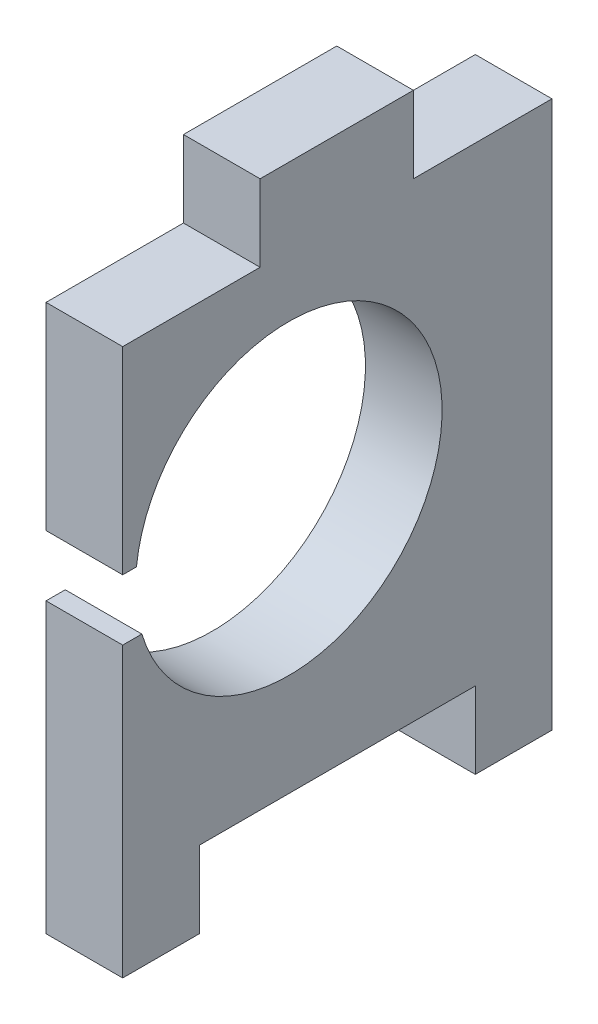
ISO-10303-21;
HEADER;
FILE_DESCRIPTION(('STEP AP214'),'2;1');
FILE_NAME('part.step','',(''),(''),'','','');
FILE_SCHEMA(('AUTOMOTIVE_DESIGN { 1 0 10303 214 1 1 1 1 }'));
ENDSEC;
DATA;
#1=APPLICATION_CONTEXT('core data for automotive mechanical design processes');
#2=APPLICATION_PROTOCOL_DEFINITION('international standard','automotive_design',2000,#1);
#3=PRODUCT_CONTEXT('',#1,'mechanical');
#4=PRODUCT('Part','Part','',(#3));
#5=PRODUCT_RELATED_PRODUCT_CATEGORY('part','',(#4));
#6=PRODUCT_DEFINITION_FORMATION('','',#4);
#7=PRODUCT_DEFINITION_CONTEXT('part definition',#1,'design');
#8=PRODUCT_DEFINITION('design','',#6,#7);
#9=PRODUCT_DEFINITION_SHAPE('','',#8);
#10=(LENGTH_UNIT() NAMED_UNIT(*) SI_UNIT(.MILLI.,.METRE.));
#11=(NAMED_UNIT(*) PLANE_ANGLE_UNIT() SI_UNIT($,.RADIAN.));
#12=(NAMED_UNIT(*) SI_UNIT($,.STERADIAN.) SOLID_ANGLE_UNIT());
#13=UNCERTAINTY_MEASURE_WITH_UNIT(LENGTH_MEASURE(1.E-05),#10,'distance_accuracy_value','');
#14=(GEOMETRIC_REPRESENTATION_CONTEXT(3) GLOBAL_UNCERTAINTY_ASSIGNED_CONTEXT((#13)) GLOBAL_UNIT_ASSIGNED_CONTEXT((#10,
#11,#12)) REPRESENTATION_CONTEXT('',''));
#15=CARTESIAN_POINT('',(0.,0.,0.));
#16=DIRECTION('',(0.,0.,1.));
#17=DIRECTION('',(1.,0.,0.));
#18=AXIS2_PLACEMENT_3D('',#15,#16,#17);
#19=CARTESIAN_POINT('',(80.894661100132,18.4,0.));
#20=DIRECTION('',(0.,1.,0.));
#21=DIRECTION('',(0.,0.,1.));
#22=AXIS2_PLACEMENT_3D('',#19,#20,#21);
#23=PLANE('',#22);
#24=DIRECTION('',(0.,0.,1.));
#25=VECTOR('',#24,1.);
#26=CARTESIAN_POINT('',(80.894661100132,18.4,0.));
#27=LINE('',#26,#25);
#28=CARTESIAN_POINT('',(80.894661100132,18.4,-16.8));
#29=VERTEX_POINT('',#28);
#30=CARTESIAN_POINT('',(80.894661100132,18.4,-11.3779778877362));
#31=VERTEX_POINT('',#30);
#32=EDGE_CURVE('E200',#29,#31,#27,.T.);
#33=ORIENTED_EDGE('',*,*,#32,.T.);
#34=DIRECTION('',(1.,0.,0.));
#35=VECTOR('',#34,1.);
#36=CARTESIAN_POINT('',(74.1864571676327,18.4,-11.3779778877362));
#37=LINE('',#36,#35);
#38=CARTESIAN_POINT('',(83.894661100132,18.4,-11.3779778877362));
#39=VERTEX_POINT('',#38);
#40=EDGE_CURVE('E259',#31,#39,#37,.T.);
#41=ORIENTED_EDGE('',*,*,#40,.T.);
#42=DIRECTION('',(0.,0.,1.));
#43=VECTOR('',#42,1.);
#44=CARTESIAN_POINT('',(83.894661100132,18.4,0.));
#45=LINE('',#44,#43);
#46=CARTESIAN_POINT('',(83.894661100132,18.4,-16.8));
#47=VERTEX_POINT('',#46);
#48=EDGE_CURVE('E206',#47,#39,#45,.T.);
#49=ORIENTED_EDGE('',*,*,#48,.F.);
#50=DIRECTION('',(1.,0.,0.));
#51=VECTOR('',#50,1.);
#52=CARTESIAN_POINT('',(80.894661100132,18.4,-16.8));
#53=LINE('',#52,#51);
#54=EDGE_CURVE('E213',#29,#47,#53,.T.);
#55=ORIENTED_EDGE('',*,*,#54,.F.);
#56=EDGE_LOOP('',(#33,#41,#49,#55));
#57=FACE_BOUND('',#56,.T.);
#58=ADVANCED_FACE('F32',(#57),#23,.T.);
#59=CARTESIAN_POINT('',(80.894661100132,18.4,0.));
#60=DIRECTION('',(0.,0.,1.));
#61=DIRECTION('',(1.,0.,0.));
#62=AXIS2_PLACEMENT_3D('',#59,#60,#61);
#63=PLANE('',#62);
#64=DIRECTION('',(0.,-1.,0.));
#65=VECTOR('',#64,1.);
#66=CARTESIAN_POINT('',(83.894661100132,18.4,0.));
#67=LINE('',#66,#65);
#68=CARTESIAN_POINT('',(83.894661100132,18.4,0.));
#69=VERTEX_POINT('',#68);
#70=CARTESIAN_POINT('',(83.894661100132,10.6647891217904,0.));
#71=VERTEX_POINT('',#70);
#72=EDGE_CURVE('E161',#69,#71,#67,.T.);
#73=ORIENTED_EDGE('',*,*,#72,.F.);
#74=DIRECTION('',(1.,0.,0.));
#75=VECTOR('',#74,1.);
#76=CARTESIAN_POINT('',(80.894661100132,18.4,0.));
#77=LINE('',#76,#75);
#78=CARTESIAN_POINT('',(80.894661100132,18.4,0.));
#79=VERTEX_POINT('',#78);
#80=EDGE_CURVE('E40',#79,#69,#77,.T.);
#81=ORIENTED_EDGE('',*,*,#80,.F.);
#82=DIRECTION('',(0.,-1.,0.));
#83=VECTOR('',#82,1.);
#84=CARTESIAN_POINT('',(80.894661100132,18.4,0.));
#85=LINE('',#84,#83);
#86=CARTESIAN_POINT('',(80.894661100132,10.6647891217904,0.));
#87=VERTEX_POINT('',#86);
#88=EDGE_CURVE('E221',#79,#87,#85,.T.);
#89=ORIENTED_EDGE('',*,*,#88,.T.);
#90=DIRECTION('',(1.,0.,0.));
#91=VECTOR('',#90,1.);
#92=CARTESIAN_POINT('',(80.894661100132,10.6647891217904,0.));
#93=LINE('',#92,#91);
#94=EDGE_CURVE('E203',#87,#71,#93,.T.);
#95=ORIENTED_EDGE('',*,*,#94,.T.);
#96=EDGE_LOOP('',(#73,#81,#89,#95));
#97=FACE_BOUND('',#96,.T.);
#98=ADVANCED_FACE('F34',(#97),#63,.T.);
#99=DIRECTION('',(1.,0.,0.));
#100=VECTOR('',#99,1.);
#101=CARTESIAN_POINT('',(74.1864571676327,18.4,-5.37797788773624));
#102=LINE('',#101,#100);
#103=CARTESIAN_POINT('',(80.894661100132,18.4,-5.37797788773624));
#104=VERTEX_POINT('',#103);
#105=CARTESIAN_POINT('',(83.894661100132,18.4,-5.37797788773624));
#106=VERTEX_POINT('',#105);
#107=EDGE_CURVE('E166',#104,#106,#102,.T.);
#108=ORIENTED_EDGE('',*,*,#107,.F.);
#109=EDGE_CURVE('E194',#104,#79,#27,.T.);
#110=ORIENTED_EDGE('',*,*,#109,.T.);
#111=ORIENTED_EDGE('',*,*,#80,.T.);
#112=EDGE_CURVE('E204',#106,#69,#45,.T.);
#113=ORIENTED_EDGE('',*,*,#112,.F.);
#114=EDGE_LOOP('',(#108,#110,#111,#113));
#115=FACE_BOUND('',#114,.T.);
#116=ADVANCED_FACE('F281',(#115),#23,.T.);
#117=CARTESIAN_POINT('',(80.894661100132,18.4,-16.8));
#118=DIRECTION('',(0.,0.,-1.));
#119=DIRECTION('',(-1.,0.,0.));
#120=AXIS2_PLACEMENT_3D('',#117,#118,#119);
#121=PLANE('',#120);
#122=DIRECTION('',(0.,1.,0.));
#123=VECTOR('',#122,1.);
#124=CARTESIAN_POINT('',(83.894661100132,18.4,-16.8));
#125=LINE('',#124,#123);
#126=CARTESIAN_POINT('',(83.894661100132,-3.,-16.8));
#127=VERTEX_POINT('',#126);
#128=EDGE_CURVE('E174',#127,#47,#125,.T.);
#129=ORIENTED_EDGE('',*,*,#128,.F.);
#130=DIRECTION('',(1.,0.,0.));
#131=VECTOR('',#130,1.);
#132=CARTESIAN_POINT('',(74.1864571676327,-3.,-16.8));
#133=LINE('',#132,#131);
#134=CARTESIAN_POINT('',(80.894661100132,-3.,-16.8));
#135=VERTEX_POINT('',#134);
#136=EDGE_CURVE('E483',#135,#127,#133,.T.);
#137=ORIENTED_EDGE('',*,*,#136,.F.);
#138=DIRECTION('',(0.,1.,0.));
#139=VECTOR('',#138,1.);
#140=CARTESIAN_POINT('',(80.894661100132,18.4,-16.8));
#141=LINE('',#140,#139);
#142=EDGE_CURVE('E185',#135,#29,#141,.T.);
#143=ORIENTED_EDGE('',*,*,#142,.T.);
#144=ORIENTED_EDGE('',*,*,#54,.T.);
#145=EDGE_LOOP('',(#129,#137,#143,#144));
#146=FACE_BOUND('',#145,.T.);
#147=ADVANCED_FACE('F283',(#146),#121,.T.);
#148=CARTESIAN_POINT('',(80.894661100132,0.,0.));
#149=DIRECTION('',(0.,-1.,0.));
#150=DIRECTION('',(0.,0.,-1.));
#151=AXIS2_PLACEMENT_3D('',#148,#149,#150);
#152=PLANE('',#151);
#153=DIRECTION('',(1.,0.,0.));
#154=VECTOR('',#153,1.);
#155=CARTESIAN_POINT('',(74.1864571676327,0.,-13.8));
#156=LINE('',#155,#154);
#157=CARTESIAN_POINT('',(80.894661100132,0.,-13.8));
#158=VERTEX_POINT('',#157);
#159=CARTESIAN_POINT('',(83.894661100132,0.,-13.8));
#160=VERTEX_POINT('',#159);
#161=EDGE_CURVE('E465',#158,#160,#156,.T.);
#162=ORIENTED_EDGE('',*,*,#161,.T.);
#163=DIRECTION('',(0.,0.,-1.));
#164=VECTOR('',#163,1.);
#165=CARTESIAN_POINT('',(83.894661100132,0.,0.));
#166=LINE('',#165,#164);
#167=CARTESIAN_POINT('',(83.894661100132,0.,-3.));
#168=VERTEX_POINT('',#167);
#169=EDGE_CURVE('E171',#168,#160,#166,.T.);
#170=ORIENTED_EDGE('',*,*,#169,.F.);
#171=DIRECTION('',(1.,0.,0.));
#172=VECTOR('',#171,1.);
#173=CARTESIAN_POINT('',(74.1864571676327,0.,-3.));
#174=LINE('',#173,#172);
#175=CARTESIAN_POINT('',(80.894661100132,0.,-3.));
#176=VERTEX_POINT('',#175);
#177=EDGE_CURVE('E54',#176,#168,#174,.T.);
#178=ORIENTED_EDGE('',*,*,#177,.F.);
#179=DIRECTION('',(0.,0.,-1.));
#180=VECTOR('',#179,1.);
#181=CARTESIAN_POINT('',(80.894661100132,0.,0.));
#182=LINE('',#181,#180);
#183=EDGE_CURVE('E182',#176,#158,#182,.T.);
#184=ORIENTED_EDGE('',*,*,#183,.T.);
#185=EDGE_LOOP('',(#162,#170,#178,#184));
#186=FACE_BOUND('',#185,.T.);
#187=ADVANCED_FACE('F289',(#186),#152,.T.);
#188=CARTESIAN_POINT('',(80.894661100132,8.28400240204985,0.));
#189=DIRECTION('',(0.,0.,1.));
#190=DIRECTION('',(1.,0.,0.));
#191=AXIS2_PLACEMENT_3D('',#188,#189,#190);
#192=PLANE('',#191);
#193=DIRECTION('',(0.,-1.,0.));
#194=VECTOR('',#193,1.);
#195=CARTESIAN_POINT('',(83.894661100132,8.28400240204985,0.));
#196=LINE('',#195,#194);
#197=CARTESIAN_POINT('',(83.894661100132,8.28400240204985,0.));
#198=VERTEX_POINT('',#197);
#199=CARTESIAN_POINT('',(83.894661100132,-3.,0.));
#200=VERTEX_POINT('',#199);
#201=EDGE_CURVE('E164',#198,#200,#196,.T.);
#202=ORIENTED_EDGE('',*,*,#201,.F.);
#203=DIRECTION('',(1.,0.,0.));
#204=VECTOR('',#203,1.);
#205=CARTESIAN_POINT('',(80.894661100132,8.28400240204985,0.));
#206=LINE('',#205,#204);
#207=CARTESIAN_POINT('',(80.894661100132,8.28400240204985,0.));
#208=VERTEX_POINT('',#207);
#209=EDGE_CURVE('E215',#208,#198,#206,.T.);
#210=ORIENTED_EDGE('',*,*,#209,.F.);
#211=DIRECTION('',(0.,-1.,0.));
#212=VECTOR('',#211,1.);
#213=CARTESIAN_POINT('',(80.894661100132,8.28400240204985,0.));
#214=LINE('',#213,#212);
#215=CARTESIAN_POINT('',(80.894661100132,-3.,0.));
#216=VERTEX_POINT('',#215);
#217=EDGE_CURVE('E186',#208,#216,#214,.T.);
#218=ORIENTED_EDGE('',*,*,#217,.T.);
#219=DIRECTION('',(1.,0.,0.));
#220=VECTOR('',#219,1.);
#221=CARTESIAN_POINT('',(74.1864571676327,-3.,0.));
#222=LINE('',#221,#220);
#223=EDGE_CURVE('E242',#216,#200,#222,.T.);
#224=ORIENTED_EDGE('',*,*,#223,.T.);
#225=EDGE_LOOP('',(#202,#210,#218,#224));
#226=FACE_BOUND('',#225,.T.);
#227=ADVANCED_FACE('F420',(#226),#192,.T.);
#228=CARTESIAN_POINT('',(80.894661100132,8.28400240204985,0.));
#229=DIRECTION('',(0.,1.,0.));
#230=DIRECTION('',(0.,0.,1.));
#231=AXIS2_PLACEMENT_3D('',#228,#229,#230);
#232=PLANE('',#231);
#233=DIRECTION('',(1.,0.,0.));
#234=VECTOR('',#233,1.);
#235=CARTESIAN_POINT('',(-4.09999999999999,8.28400240204985,-0.750621577611251));
#236=LINE('',#235,#234);
#237=CARTESIAN_POINT('',(80.894661100132,8.28400240204985,-0.750621577611251));
#238=VERTEX_POINT('',#237);
#239=CARTESIAN_POINT('',(83.894661100132,8.28400240204985,-0.750621577611251));
#240=VERTEX_POINT('',#239);
#241=EDGE_CURVE('E47',#238,#240,#236,.T.);
#242=ORIENTED_EDGE('',*,*,#241,.F.);
#243=DIRECTION('',(0.,0.,1.));
#244=VECTOR('',#243,1.);
#245=CARTESIAN_POINT('',(80.894661100132,8.28400240204985,0.));
#246=LINE('',#245,#244);
#247=EDGE_CURVE('E226',#238,#208,#246,.T.);
#248=ORIENTED_EDGE('',*,*,#247,.T.);
#249=ORIENTED_EDGE('',*,*,#209,.T.);
#250=DIRECTION('',(0.,0.,1.));
#251=VECTOR('',#250,1.);
#252=CARTESIAN_POINT('',(83.894661100132,8.28400240204985,0.));
#253=LINE('',#252,#251);
#254=EDGE_CURVE('E162',#240,#198,#253,.T.);
#255=ORIENTED_EDGE('',*,*,#254,.F.);
#256=EDGE_LOOP('',(#242,#248,#249,#255));
#257=FACE_BOUND('',#256,.T.);
#258=ADVANCED_FACE('F411',(#257),#232,.T.);
#259=CARTESIAN_POINT('',(80.894661100132,10.6647891217904,-3.46505971101863));
#260=DIRECTION('',(0.,-1.,0.));
#261=DIRECTION('',(0.,0.,-1.));
#262=AXIS2_PLACEMENT_3D('',#259,#260,#261);
#263=PLANE('',#262);
#264=DIRECTION('',(1.,0.,0.));
#265=VECTOR('',#264,1.);
#266=CARTESIAN_POINT('',(-4.09999999999999,10.6647891217904,-0.536942443381146));
#267=LINE('',#266,#265);
#268=CARTESIAN_POINT('',(83.894661100132,10.6647891217904,-0.536942443381145));
#269=VERTEX_POINT('',#268);
#270=CARTESIAN_POINT('',(80.894661100132,10.6647891217904,-0.536942443381146));
#271=VERTEX_POINT('',#270);
#272=EDGE_CURVE('E144',#269,#271,#267,.F.);
#273=ORIENTED_EDGE('',*,*,#272,.F.);
#274=DIRECTION('',(0.,0.,-1.));
#275=VECTOR('',#274,1.);
#276=CARTESIAN_POINT('',(83.894661100132,10.6647891217904,-3.46505971101863));
#277=LINE('',#276,#275);
#278=EDGE_CURVE('E153',#71,#269,#277,.T.);
#279=ORIENTED_EDGE('',*,*,#278,.F.);
#280=ORIENTED_EDGE('',*,*,#94,.F.);
#281=DIRECTION('',(0.,0.,-1.));
#282=VECTOR('',#281,1.);
#283=CARTESIAN_POINT('',(80.894661100132,10.6647891217904,-3.46505971101863));
#284=LINE('',#283,#282);
#285=EDGE_CURVE('E156',#87,#271,#284,.T.);
#286=ORIENTED_EDGE('',*,*,#285,.T.);
#287=EDGE_LOOP('',(#273,#279,#280,#286));
#288=FACE_BOUND('',#287,.T.);
#289=ADVANCED_FACE('F152',(#288),#263,.T.);
#290=CARTESIAN_POINT('',(80.894661100132,0.,0.));
#291=DIRECTION('',(-1.,0.,0.));
#292=DIRECTION('',(0.,0.,1.));
#293=AXIS2_PLACEMENT_3D('',#290,#291,#292);
#294=PLANE('',#293);
#295=CARTESIAN_POINT('',(80.894661100132,10.,-6.5));
#296=DIRECTION('',(-1.,0.,0.));
#297=DIRECTION('',(0.,0.,1.));
#298=AXIS2_PLACEMENT_3D('',#295,#296,#297);
#299=CIRCLE('',#298,6.);
#300=EDGE_CURVE('E157',#271,#238,#299,.T.);
#301=ORIENTED_EDGE('',*,*,#300,.F.);
#302=ORIENTED_EDGE('',*,*,#285,.F.);
#303=ORIENTED_EDGE('',*,*,#88,.F.);
#304=ORIENTED_EDGE('',*,*,#109,.F.);
#305=DIRECTION('',(0.,-1.,0.));
#306=VECTOR('',#305,1.);
#307=CARTESIAN_POINT('',(80.894661100132,18.4,-5.37797788773624));
#308=LINE('',#307,#306);
#309=CARTESIAN_POINT('',(80.894661100132,21.4,-5.37797788773624));
#310=VERTEX_POINT('',#309);
#311=EDGE_CURVE('E236',#310,#104,#308,.T.);
#312=ORIENTED_EDGE('',*,*,#311,.F.);
#313=DIRECTION('',(0.,0.,1.));
#314=VECTOR('',#313,1.);
#315=CARTESIAN_POINT('',(80.894661100132,21.4,-5.37797788773624));
#316=LINE('',#315,#314);
#317=CARTESIAN_POINT('',(80.894661100132,21.4,-11.3779778877362));
#318=VERTEX_POINT('',#317);
#319=EDGE_CURVE('E260',#318,#310,#316,.T.);
#320=ORIENTED_EDGE('',*,*,#319,.F.);
#321=DIRECTION('',(0.,1.,0.));
#322=VECTOR('',#321,1.);
#323=CARTESIAN_POINT('',(80.894661100132,18.4,-11.3779778877362));
#324=LINE('',#323,#322);
#325=EDGE_CURVE('E265',#31,#318,#324,.T.);
#326=ORIENTED_EDGE('',*,*,#325,.F.);
#327=ORIENTED_EDGE('',*,*,#32,.F.);
#328=ORIENTED_EDGE('',*,*,#142,.F.);
#329=DIRECTION('',(0.,0.,-1.));
#330=VECTOR('',#329,1.);
#331=CARTESIAN_POINT('',(80.894661100132,-3.,-16.8));
#332=LINE('',#331,#330);
#333=CARTESIAN_POINT('',(80.894661100132,-3.,-13.8));
#334=VERTEX_POINT('',#333);
#335=EDGE_CURVE('E493',#334,#135,#332,.T.);
#336=ORIENTED_EDGE('',*,*,#335,.F.);
#337=DIRECTION('',(0.,-1.,0.));
#338=VECTOR('',#337,1.);
#339=CARTESIAN_POINT('',(80.894661100132,0.,-13.8));
#340=LINE('',#339,#338);
#341=EDGE_CURVE('E467',#158,#334,#340,.T.);
#342=ORIENTED_EDGE('',*,*,#341,.F.);
#343=ORIENTED_EDGE('',*,*,#183,.F.);
#344=DIRECTION('',(0.,1.,0.));
#345=VECTOR('',#344,1.);
#346=CARTESIAN_POINT('',(80.894661100132,0.,-3.));
#347=LINE('',#346,#345);
#348=CARTESIAN_POINT('',(80.894661100132,-3.,-3.));
#349=VERTEX_POINT('',#348);
#350=EDGE_CURVE('E254',#349,#176,#347,.T.);
#351=ORIENTED_EDGE('',*,*,#350,.F.);
#352=DIRECTION('',(0.,0.,-1.));
#353=VECTOR('',#352,1.);
#354=CARTESIAN_POINT('',(80.894661100132,-3.,0.));
#355=LINE('',#354,#353);
#356=EDGE_CURVE('E480',#216,#349,#355,.T.);
#357=ORIENTED_EDGE('',*,*,#356,.F.);
#358=ORIENTED_EDGE('',*,*,#217,.F.);
#359=ORIENTED_EDGE('',*,*,#247,.F.);
#360=EDGE_LOOP('',(#301,#302,#303,#304,#312,#320,#326,#327,#328,#336,#342,#343,#351,#357,#358,#359));
#361=FACE_BOUND('',#360,.T.);
#362=ADVANCED_FACE('F223',(#361),#294,.T.);
#363=CARTESIAN_POINT('',(83.894661100132,0.,0.));
#364=DIRECTION('',(-1.,0.,0.));
#365=DIRECTION('',(0.,0.,1.));
#366=AXIS2_PLACEMENT_3D('',#363,#364,#365);
#367=PLANE('',#366);
#368=ORIENTED_EDGE('',*,*,#278,.T.);
#369=CARTESIAN_POINT('',(83.894661100132,10.,-6.5));
#370=DIRECTION('',(-1.,0.,0.));
#371=DIRECTION('',(0.,0.,1.));
#372=AXIS2_PLACEMENT_3D('',#369,#370,#371);
#373=CIRCLE('',#372,6.);
#374=EDGE_CURVE('E11',#269,#240,#373,.T.);
#375=ORIENTED_EDGE('',*,*,#374,.T.);
#376=ORIENTED_EDGE('',*,*,#254,.T.);
#377=ORIENTED_EDGE('',*,*,#201,.T.);
#378=DIRECTION('',(0.,0.,-1.));
#379=VECTOR('',#378,1.);
#380=CARTESIAN_POINT('',(83.894661100132,-3.,0.));
#381=LINE('',#380,#379);
#382=CARTESIAN_POINT('',(83.894661100132,-3.,-3.));
#383=VERTEX_POINT('',#382);
#384=EDGE_CURVE('E478',#200,#383,#381,.T.);
#385=ORIENTED_EDGE('',*,*,#384,.T.);
#386=DIRECTION('',(0.,1.,0.));
#387=VECTOR('',#386,1.);
#388=CARTESIAN_POINT('',(83.894661100132,0.,-3.));
#389=LINE('',#388,#387);
#390=EDGE_CURVE('E477',#383,#168,#389,.T.);
#391=ORIENTED_EDGE('',*,*,#390,.T.);
#392=ORIENTED_EDGE('',*,*,#169,.T.);
#393=DIRECTION('',(0.,-1.,0.));
#394=VECTOR('',#393,1.);
#395=CARTESIAN_POINT('',(83.894661100132,0.,-13.8));
#396=LINE('',#395,#394);
#397=CARTESIAN_POINT('',(83.894661100132,-3.,-13.8));
#398=VERTEX_POINT('',#397);
#399=EDGE_CURVE('E473',#160,#398,#396,.T.);
#400=ORIENTED_EDGE('',*,*,#399,.T.);
#401=DIRECTION('',(0.,0.,-1.));
#402=VECTOR('',#401,1.);
#403=CARTESIAN_POINT('',(83.894661100132,-3.,-16.8));
#404=LINE('',#403,#402);
#405=EDGE_CURVE('E468',#398,#127,#404,.T.);
#406=ORIENTED_EDGE('',*,*,#405,.T.);
#407=ORIENTED_EDGE('',*,*,#128,.T.);
#408=ORIENTED_EDGE('',*,*,#48,.T.);
#409=DIRECTION('',(0.,1.,0.));
#410=VECTOR('',#409,1.);
#411=CARTESIAN_POINT('',(83.894661100132,18.4,-11.3779778877362));
#412=LINE('',#411,#410);
#413=CARTESIAN_POINT('',(83.894661100132,21.4,-11.3779778877362));
#414=VERTEX_POINT('',#413);
#415=EDGE_CURVE('E241',#39,#414,#412,.T.);
#416=ORIENTED_EDGE('',*,*,#415,.T.);
#417=DIRECTION('',(0.,0.,1.));
#418=VECTOR('',#417,1.);
#419=CARTESIAN_POINT('',(83.894661100132,21.4,-5.37797788773624));
#420=LINE('',#419,#418);
#421=CARTESIAN_POINT('',(83.894661100132,21.4,-5.37797788773624));
#422=VERTEX_POINT('',#421);
#423=EDGE_CURVE('E247',#414,#422,#420,.T.);
#424=ORIENTED_EDGE('',*,*,#423,.T.);
#425=DIRECTION('',(0.,-1.,0.));
#426=VECTOR('',#425,1.);
#427=CARTESIAN_POINT('',(83.894661100132,18.4,-5.37797788773624));
#428=LINE('',#427,#426);
#429=EDGE_CURVE('E239',#422,#106,#428,.T.);
#430=ORIENTED_EDGE('',*,*,#429,.T.);
#431=ORIENTED_EDGE('',*,*,#112,.T.);
#432=ORIENTED_EDGE('',*,*,#72,.T.);
#433=EDGE_LOOP('',(#368,#375,#376,#377,#385,#391,#392,#400,#406,#407,#408,#416,#424,#430,#431,#432));
#434=FACE_BOUND('',#433,.T.);
#435=ADVANCED_FACE('F159',(#434),#367,.F.);
#436=CARTESIAN_POINT('',(74.1864571676327,18.4,-11.3779778877362));
#437=DIRECTION('',(0.,0.,-1.));
#438=DIRECTION('',(-1.,0.,0.));
#439=AXIS2_PLACEMENT_3D('',#436,#437,#438);
#440=PLANE('',#439);
#441=ORIENTED_EDGE('',*,*,#40,.F.);
#442=ORIENTED_EDGE('',*,*,#325,.T.);
#443=DIRECTION('',(1.,0.,0.));
#444=VECTOR('',#443,1.);
#445=CARTESIAN_POINT('',(74.1864571676327,21.4,-11.3779778877362));
#446=LINE('',#445,#444);
#447=EDGE_CURVE('E264',#318,#414,#446,.T.);
#448=ORIENTED_EDGE('',*,*,#447,.T.);
#449=ORIENTED_EDGE('',*,*,#415,.F.);
#450=EDGE_LOOP('',(#441,#442,#448,#449));
#451=FACE_BOUND('',#450,.T.);
#452=ADVANCED_FACE('F301',(#451),#440,.T.);
#453=CARTESIAN_POINT('',(74.1864571676327,21.4,-5.37797788773624));
#454=DIRECTION('',(0.,1.,0.));
#455=DIRECTION('',(0.,0.,1.));
#456=AXIS2_PLACEMENT_3D('',#453,#454,#455);
#457=PLANE('',#456);
#458=ORIENTED_EDGE('',*,*,#447,.F.);
#459=ORIENTED_EDGE('',*,*,#319,.T.);
#460=DIRECTION('',(1.,0.,0.));
#461=VECTOR('',#460,1.);
#462=CARTESIAN_POINT('',(74.1864571676327,21.4,-5.37797788773624));
#463=LINE('',#462,#461);
#464=EDGE_CURVE('E263',#310,#422,#463,.T.);
#465=ORIENTED_EDGE('',*,*,#464,.T.);
#466=ORIENTED_EDGE('',*,*,#423,.F.);
#467=EDGE_LOOP('',(#458,#459,#465,#466));
#468=FACE_BOUND('',#467,.T.);
#469=ADVANCED_FACE('F305',(#468),#457,.T.);
#470=CARTESIAN_POINT('',(74.1864571676327,18.4,-5.37797788773624));
#471=DIRECTION('',(0.,0.,1.));
#472=DIRECTION('',(1.,0.,0.));
#473=AXIS2_PLACEMENT_3D('',#470,#471,#472);
#474=PLANE('',#473);
#475=ORIENTED_EDGE('',*,*,#464,.F.);
#476=ORIENTED_EDGE('',*,*,#311,.T.);
#477=ORIENTED_EDGE('',*,*,#107,.T.);
#478=ORIENTED_EDGE('',*,*,#429,.F.);
#479=EDGE_LOOP('',(#475,#476,#477,#478));
#480=FACE_BOUND('',#479,.T.);
#481=ADVANCED_FACE('F279',(#480),#474,.T.);
#482=CARTESIAN_POINT('',(74.1864571676327,-3.,0.));
#483=DIRECTION('',(0.,-1.,0.));
#484=DIRECTION('',(0.,0.,-1.));
#485=AXIS2_PLACEMENT_3D('',#482,#483,#484);
#486=PLANE('',#485);
#487=ORIENTED_EDGE('',*,*,#223,.F.);
#488=ORIENTED_EDGE('',*,*,#356,.T.);
#489=DIRECTION('',(1.,0.,0.));
#490=VECTOR('',#489,1.);
#491=CARTESIAN_POINT('',(74.1864571676327,-3.,-3.));
#492=LINE('',#491,#490);
#493=EDGE_CURVE('E257',#349,#383,#492,.T.);
#494=ORIENTED_EDGE('',*,*,#493,.T.);
#495=ORIENTED_EDGE('',*,*,#384,.F.);
#496=EDGE_LOOP('',(#487,#488,#494,#495));
#497=FACE_BOUND('',#496,.T.);
#498=ADVANCED_FACE('F312',(#497),#486,.T.);
#499=CARTESIAN_POINT('',(74.1864571676327,0.,-3.));
#500=DIRECTION('',(0.,0.,-1.));
#501=DIRECTION('',(0.,1.,0.));
#502=AXIS2_PLACEMENT_3D('',#499,#500,#501);
#503=PLANE('',#502);
#504=ORIENTED_EDGE('',*,*,#493,.F.);
#505=ORIENTED_EDGE('',*,*,#350,.T.);
#506=ORIENTED_EDGE('',*,*,#177,.T.);
#507=ORIENTED_EDGE('',*,*,#390,.F.);
#508=EDGE_LOOP('',(#504,#505,#506,#507));
#509=FACE_BOUND('',#508,.T.);
#510=ADVANCED_FACE('F351',(#509),#503,.T.);
#511=CARTESIAN_POINT('',(74.1864571676327,0.,-13.8));
#512=DIRECTION('',(0.,0.,1.));
#513=DIRECTION('',(1.,0.,0.));
#514=AXIS2_PLACEMENT_3D('',#511,#512,#513);
#515=PLANE('',#514);
#516=ORIENTED_EDGE('',*,*,#161,.F.);
#517=ORIENTED_EDGE('',*,*,#341,.T.);
#518=DIRECTION('',(1.,0.,0.));
#519=VECTOR('',#518,1.);
#520=CARTESIAN_POINT('',(74.1864571676327,-3.,-13.8));
#521=LINE('',#520,#519);
#522=EDGE_CURVE('E495',#334,#398,#521,.T.);
#523=ORIENTED_EDGE('',*,*,#522,.T.);
#524=ORIENTED_EDGE('',*,*,#399,.F.);
#525=EDGE_LOOP('',(#516,#517,#523,#524));
#526=FACE_BOUND('',#525,.T.);
#527=ADVANCED_FACE('F361',(#526),#515,.T.);
#528=CARTESIAN_POINT('',(74.1864571676327,-3.,-16.8));
#529=DIRECTION('',(0.,-1.,0.));
#530=DIRECTION('',(0.,0.,-1.));
#531=AXIS2_PLACEMENT_3D('',#528,#529,#530);
#532=PLANE('',#531);
#533=ORIENTED_EDGE('',*,*,#522,.F.);
#534=ORIENTED_EDGE('',*,*,#335,.T.);
#535=ORIENTED_EDGE('',*,*,#136,.T.);
#536=ORIENTED_EDGE('',*,*,#405,.F.);
#537=EDGE_LOOP('',(#533,#534,#535,#536));
#538=FACE_BOUND('',#537,.T.);
#539=ADVANCED_FACE('F371',(#538),#532,.T.);
#540=CARTESIAN_POINT('',(-4.09999999999999,10.,-6.5));
#541=DIRECTION('',(1.,0.,0.));
#542=DIRECTION('',(0.,0.,-1.));
#543=AXIS2_PLACEMENT_3D('',#540,#541,#542);
#544=CYLINDRICAL_SURFACE('',#543,6.);
#545=ORIENTED_EDGE('',*,*,#241,.T.);
#546=ORIENTED_EDGE('',*,*,#374,.F.);
#547=ORIENTED_EDGE('',*,*,#272,.T.);
#548=ORIENTED_EDGE('',*,*,#300,.T.);
#549=EDGE_LOOP('',(#545,#546,#547,#548));
#550=FACE_BOUND('',#549,.T.);
#551=ADVANCED_FACE('F143',(#550),#544,.F.);
#552=CLOSED_SHELL('',(#58,#98,#116,#147,#187,#227,#258,#289,#362,#435,#452,#469,#481,#498,#510,
#527,#539,#551));
#553=MANIFOLD_SOLID_BREP('B2',#552);
#554=ADVANCED_BREP_SHAPE_REPRESENTATION('',(#18,#553),#14);
#555=SHAPE_DEFINITION_REPRESENTATION(#9,#554);
ENDSEC;
END-ISO-10303-21;
